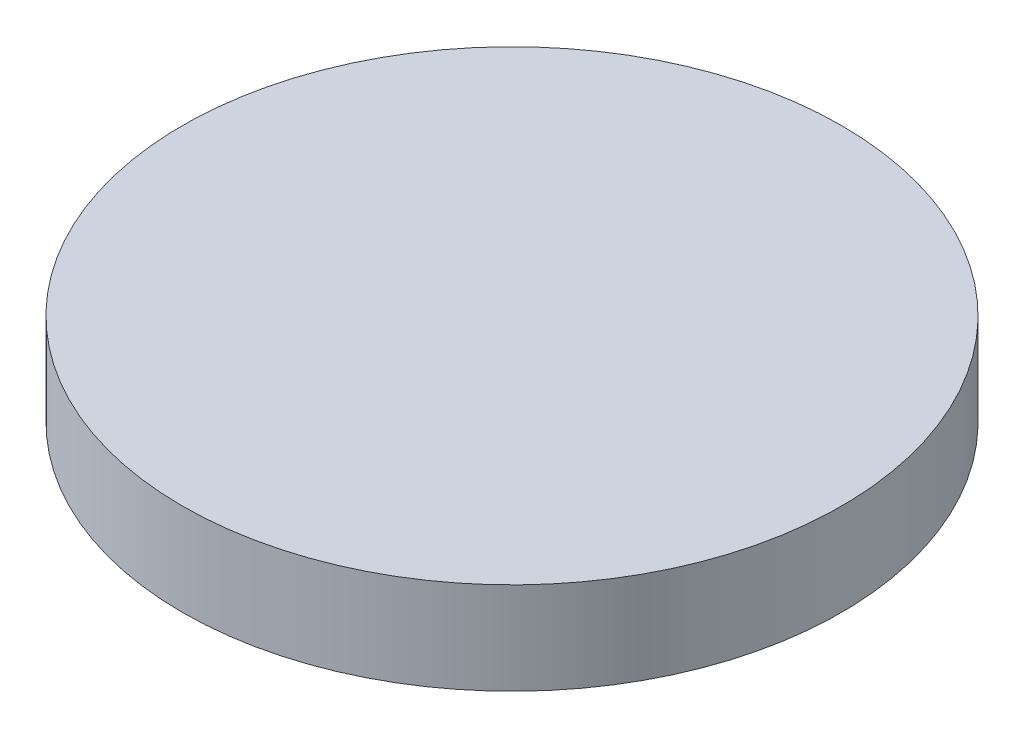
ISO-10303-21;
HEADER;
FILE_DESCRIPTION(('STEP AP214'),'2;1');
FILE_NAME('part.step','',(''),(''),'','','');
FILE_SCHEMA(('AUTOMOTIVE_DESIGN { 1 0 10303 214 1 1 1 1 }'));
ENDSEC;
DATA;
#1=APPLICATION_CONTEXT('core data for automotive mechanical design processes');
#2=APPLICATION_PROTOCOL_DEFINITION('international standard','automotive_design',2000,#1);
#3=PRODUCT_CONTEXT('',#1,'mechanical');
#4=PRODUCT('Part','Part','',(#3));
#5=PRODUCT_RELATED_PRODUCT_CATEGORY('part','',(#4));
#6=PRODUCT_DEFINITION_FORMATION('','',#4);
#7=PRODUCT_DEFINITION_CONTEXT('part definition',#1,'design');
#8=PRODUCT_DEFINITION('design','',#6,#7);
#9=PRODUCT_DEFINITION_SHAPE('','',#8);
#10=(LENGTH_UNIT() NAMED_UNIT(*) SI_UNIT(.MILLI.,.METRE.));
#11=(NAMED_UNIT(*) PLANE_ANGLE_UNIT() SI_UNIT($,.RADIAN.));
#12=(NAMED_UNIT(*) SI_UNIT($,.STERADIAN.) SOLID_ANGLE_UNIT());
#13=UNCERTAINTY_MEASURE_WITH_UNIT(LENGTH_MEASURE(1.E-05),#10,'distance_accuracy_value','');
#14=(GEOMETRIC_REPRESENTATION_CONTEXT(3) GLOBAL_UNCERTAINTY_ASSIGNED_CONTEXT((#13)) GLOBAL_UNIT_ASSIGNED_CONTEXT((#10,
#11,#12)) REPRESENTATION_CONTEXT('',''));
#15=CARTESIAN_POINT('',(0.,0.,0.));
#16=DIRECTION('',(0.,0.,1.));
#17=DIRECTION('',(1.,0.,0.));
#18=AXIS2_PLACEMENT_3D('',#15,#16,#17);
#19=CARTESIAN_POINT('',(7.3,14.,-20.));
#20=DIRECTION('',(0.,-1.,0.));
#21=DIRECTION('',(0.,0.,-1.));
#22=AXIS2_PLACEMENT_3D('',#19,#20,#21);
#23=CYLINDRICAL_SURFACE('',#22,3.57647482007185);
#24=CARTESIAN_POINT('',(7.3,13.,-20.));
#25=DIRECTION('',(0.,1.,0.));
#26=DIRECTION('',(0.,0.,1.));
#27=AXIS2_PLACEMENT_3D('',#24,#25,#26);
#28=CIRCLE('',#27,3.57647482007185);
#29=CARTESIAN_POINT('',(7.3,13.,-16.4235251799281));
#30=VERTEX_POINT('',#29);
#31=EDGE_CURVE('E10',#30,#30,#28,.T.);
#32=ORIENTED_EDGE('',*,*,#31,.T.);
#33=EDGE_LOOP('',(#32));
#34=FACE_BOUND('',#33,.T.);
#35=CARTESIAN_POINT('',(7.3,14.,-20.));
#36=DIRECTION('',(0.,1.,0.));
#37=DIRECTION('',(0.,0.,1.));
#38=AXIS2_PLACEMENT_3D('',#35,#36,#37);
#39=CIRCLE('',#38,3.57647482007185);
#40=CARTESIAN_POINT('',(7.3,14.,-16.4235251799281));
#41=VERTEX_POINT('',#40);
#42=EDGE_CURVE('E21',#41,#41,#39,.T.);
#43=ORIENTED_EDGE('',*,*,#42,.F.);
#44=EDGE_LOOP('',(#43));
#45=FACE_BOUND('',#44,.T.);
#46=ADVANCED_FACE('F14',(#34,#45),#23,.T.);
#47=CARTESIAN_POINT('',(7.3,14.,-20.));
#48=DIRECTION('',(0.,1.,0.));
#49=DIRECTION('',(0.,0.,1.));
#50=AXIS2_PLACEMENT_3D('',#47,#48,#49);
#51=PLANE('',#50);
#52=ORIENTED_EDGE('',*,*,#42,.T.);
#53=EDGE_LOOP('',(#52));
#54=FACE_BOUND('',#53,.T.);
#55=ADVANCED_FACE('F27',(#54),#51,.T.);
#56=CARTESIAN_POINT('',(7.3,13.,-20.));
#57=DIRECTION('',(0.,1.,0.));
#58=DIRECTION('',(0.,0.,1.));
#59=AXIS2_PLACEMENT_3D('',#56,#57,#58);
#60=PLANE('',#59);
#61=ORIENTED_EDGE('',*,*,#31,.F.);
#62=EDGE_LOOP('',(#61));
#63=FACE_BOUND('',#62,.T.);
#64=ADVANCED_FACE('F16',(#63),#60,.F.);
#65=CLOSED_SHELL('',(#46,#55,#64));
#66=MANIFOLD_SOLID_BREP('B1',#65);
#67=ADVANCED_BREP_SHAPE_REPRESENTATION('',(#18,#66),#14);
#68=SHAPE_DEFINITION_REPRESENTATION(#9,#67);
ENDSEC;
END-ISO-10303-21;
